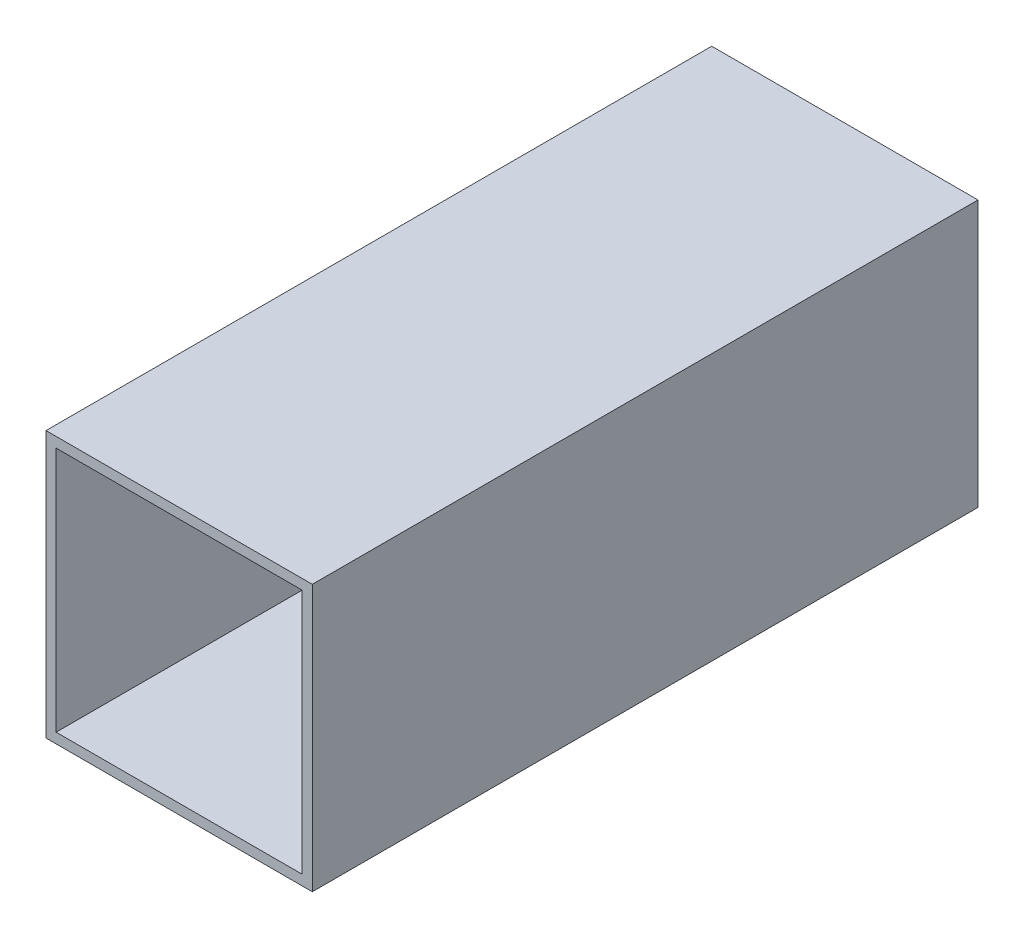
ISO-10303-21;
HEADER;
FILE_DESCRIPTION(('STEP AP214'),'2;1');
FILE_NAME('part.step','',(''),(''),'','','');
FILE_SCHEMA(('AUTOMOTIVE_DESIGN { 1 0 10303 214 1 1 1 1 }'));
ENDSEC;
DATA;
#1=APPLICATION_CONTEXT('core data for automotive mechanical design processes');
#2=APPLICATION_PROTOCOL_DEFINITION('international standard','automotive_design',2000,#1);
#3=PRODUCT_CONTEXT('',#1,'mechanical');
#4=PRODUCT('Part','Part','',(#3));
#5=PRODUCT_RELATED_PRODUCT_CATEGORY('part','',(#4));
#6=PRODUCT_DEFINITION_FORMATION('','',#4);
#7=PRODUCT_DEFINITION_CONTEXT('part definition',#1,'design');
#8=PRODUCT_DEFINITION('design','',#6,#7);
#9=PRODUCT_DEFINITION_SHAPE('','',#8);
#10=(LENGTH_UNIT() NAMED_UNIT(*) SI_UNIT(.MILLI.,.METRE.));
#11=(NAMED_UNIT(*) PLANE_ANGLE_UNIT() SI_UNIT($,.RADIAN.));
#12=(NAMED_UNIT(*) SI_UNIT($,.STERADIAN.) SOLID_ANGLE_UNIT());
#13=UNCERTAINTY_MEASURE_WITH_UNIT(LENGTH_MEASURE(1.E-05),#10,'distance_accuracy_value','');
#14=(GEOMETRIC_REPRESENTATION_CONTEXT(3) GLOBAL_UNCERTAINTY_ASSIGNED_CONTEXT((#13)) GLOBAL_UNIT_ASSIGNED_CONTEXT((#10,
#11,#12)) REPRESENTATION_CONTEXT('',''));
#15=CARTESIAN_POINT('',(0.,0.,0.));
#16=DIRECTION('',(0.,0.,1.));
#17=DIRECTION('',(1.,0.,0.));
#18=AXIS2_PLACEMENT_3D('',#15,#16,#17);
#19=CARTESIAN_POINT('',(0.,0.,190.5));
#20=DIRECTION('',(0.,0.,1.));
#21=DIRECTION('',(1.,0.,0.));
#22=AXIS2_PLACEMENT_3D('',#19,#20,#21);
#23=PLANE('',#22);
#24=DIRECTION('',(0.,-1.,0.));
#25=VECTOR('',#24,1.);
#26=CARTESIAN_POINT('',(0.,0.,190.5));
#27=LINE('',#26,#25);
#28=CARTESIAN_POINT('',(0.,0.,190.5));
#29=VERTEX_POINT('',#28);
#30=CARTESIAN_POINT('',(0.,-76.2,190.5));
#31=VERTEX_POINT('',#30);
#32=EDGE_CURVE('E134',#29,#31,#27,.T.);
#33=ORIENTED_EDGE('',*,*,#32,.T.);
#34=DIRECTION('',(1.,0.,0.));
#35=VECTOR('',#34,1.);
#36=CARTESIAN_POINT('',(0.,-76.2,190.5));
#37=LINE('',#36,#35);
#38=CARTESIAN_POINT('',(76.2,-76.2,190.5));
#39=VERTEX_POINT('',#38);
#40=EDGE_CURVE('E137',#31,#39,#37,.T.);
#41=ORIENTED_EDGE('',*,*,#40,.T.);
#42=DIRECTION('',(0.,1.,0.));
#43=VECTOR('',#42,1.);
#44=CARTESIAN_POINT('',(76.2,0.,190.5));
#45=LINE('',#44,#43);
#46=CARTESIAN_POINT('',(76.2,0.,190.5));
#47=VERTEX_POINT('',#46);
#48=EDGE_CURVE('E140',#39,#47,#45,.T.);
#49=ORIENTED_EDGE('',*,*,#48,.T.);
#50=DIRECTION('',(-1.,0.,0.));
#51=VECTOR('',#50,1.);
#52=CARTESIAN_POINT('',(0.,0.,190.5));
#53=LINE('',#52,#51);
#54=EDGE_CURVE('E142',#47,#29,#53,.T.);
#55=ORIENTED_EDGE('',*,*,#54,.T.);
#56=EDGE_LOOP('',(#33,#41,#49,#55));
#57=FACE_BOUND('',#56,.T.);
#58=DIRECTION('',(1.,0.,0.));
#59=VECTOR('',#58,1.);
#60=CARTESIAN_POINT('',(2.9,-73.3,190.5));
#61=LINE('',#60,#59);
#62=CARTESIAN_POINT('',(2.9,-73.3,190.5));
#63=VERTEX_POINT('',#62);
#64=CARTESIAN_POINT('',(73.3,-73.3,190.5));
#65=VERTEX_POINT('',#64);
#66=EDGE_CURVE('E106',#63,#65,#61,.T.);
#67=ORIENTED_EDGE('',*,*,#66,.F.);
#68=DIRECTION('',(0.,-1.,0.));
#69=VECTOR('',#68,1.);
#70=CARTESIAN_POINT('',(2.9,-2.9,190.5));
#71=LINE('',#70,#69);
#72=CARTESIAN_POINT('',(2.9,-2.9,190.5));
#73=VERTEX_POINT('',#72);
#74=EDGE_CURVE('E98',#73,#63,#71,.T.);
#75=ORIENTED_EDGE('',*,*,#74,.F.);
#76=DIRECTION('',(-1.,0.,0.));
#77=VECTOR('',#76,1.);
#78=CARTESIAN_POINT('',(2.9,-2.9,190.5));
#79=LINE('',#78,#77);
#80=CARTESIAN_POINT('',(73.3,-2.9,190.5));
#81=VERTEX_POINT('',#80);
#82=EDGE_CURVE('E120',#81,#73,#79,.T.);
#83=ORIENTED_EDGE('',*,*,#82,.F.);
#84=DIRECTION('',(0.,1.,0.));
#85=VECTOR('',#84,1.);
#86=CARTESIAN_POINT('',(73.3,-2.9,190.5));
#87=LINE('',#86,#85);
#88=EDGE_CURVE('E118',#65,#81,#87,.T.);
#89=ORIENTED_EDGE('',*,*,#88,.F.);
#90=EDGE_LOOP('',(#67,#75,#83,#89));
#91=FACE_BOUND('',#90,.T.);
#92=ADVANCED_FACE('F33',(#57,#91),#23,.T.);
#93=CARTESIAN_POINT('',(0.,0.,0.));
#94=DIRECTION('',(0.,0.,1.));
#95=DIRECTION('',(1.,0.,0.));
#96=AXIS2_PLACEMENT_3D('',#93,#94,#95);
#97=PLANE('',#96);
#98=DIRECTION('',(0.,-1.,0.));
#99=VECTOR('',#98,1.);
#100=CARTESIAN_POINT('',(0.,0.,0.));
#101=LINE('',#100,#99);
#102=CARTESIAN_POINT('',(0.,0.,0.));
#103=VERTEX_POINT('',#102);
#104=CARTESIAN_POINT('',(0.,-76.2,0.));
#105=VERTEX_POINT('',#104);
#106=EDGE_CURVE('E114',#103,#105,#101,.T.);
#107=ORIENTED_EDGE('',*,*,#106,.F.);
#108=DIRECTION('',(-1.,0.,0.));
#109=VECTOR('',#108,1.);
#110=CARTESIAN_POINT('',(0.,0.,0.));
#111=LINE('',#110,#109);
#112=CARTESIAN_POINT('',(76.2,0.,0.));
#113=VERTEX_POINT('',#112);
#114=EDGE_CURVE('E138',#113,#103,#111,.T.);
#115=ORIENTED_EDGE('',*,*,#114,.F.);
#116=DIRECTION('',(0.,1.,0.));
#117=VECTOR('',#116,1.);
#118=CARTESIAN_POINT('',(76.2,0.,0.));
#119=LINE('',#118,#117);
#120=CARTESIAN_POINT('',(76.2,-76.2,0.));
#121=VERTEX_POINT('',#120);
#122=EDGE_CURVE('E149',#121,#113,#119,.T.);
#123=ORIENTED_EDGE('',*,*,#122,.F.);
#124=DIRECTION('',(1.,0.,0.));
#125=VECTOR('',#124,1.);
#126=CARTESIAN_POINT('',(0.,-76.2,0.));
#127=LINE('',#126,#125);
#128=EDGE_CURVE('E147',#105,#121,#127,.T.);
#129=ORIENTED_EDGE('',*,*,#128,.F.);
#130=EDGE_LOOP('',(#107,#115,#123,#129));
#131=FACE_BOUND('',#130,.T.);
#132=DIRECTION('',(0.,-1.,0.));
#133=VECTOR('',#132,1.);
#134=CARTESIAN_POINT('',(2.9,-2.9,0.));
#135=LINE('',#134,#133);
#136=CARTESIAN_POINT('',(2.9,-2.9,0.));
#137=VERTEX_POINT('',#136);
#138=CARTESIAN_POINT('',(2.9,-73.3,0.));
#139=VERTEX_POINT('',#138);
#140=EDGE_CURVE('E56',#137,#139,#135,.T.);
#141=ORIENTED_EDGE('',*,*,#140,.T.);
#142=DIRECTION('',(1.,0.,0.));
#143=VECTOR('',#142,1.);
#144=CARTESIAN_POINT('',(2.9,-73.3,0.));
#145=LINE('',#144,#143);
#146=CARTESIAN_POINT('',(73.3,-73.3,0.));
#147=VERTEX_POINT('',#146);
#148=EDGE_CURVE('E113',#139,#147,#145,.T.);
#149=ORIENTED_EDGE('',*,*,#148,.T.);
#150=DIRECTION('',(0.,1.,0.));
#151=VECTOR('',#150,1.);
#152=CARTESIAN_POINT('',(73.3,-2.9,0.));
#153=LINE('',#152,#151);
#154=CARTESIAN_POINT('',(73.3,-2.9,0.));
#155=VERTEX_POINT('',#154);
#156=EDGE_CURVE('E126',#147,#155,#153,.T.);
#157=ORIENTED_EDGE('',*,*,#156,.T.);
#158=DIRECTION('',(-1.,0.,0.));
#159=VECTOR('',#158,1.);
#160=CARTESIAN_POINT('',(2.9,-2.9,0.));
#161=LINE('',#160,#159);
#162=EDGE_CURVE('E107',#155,#137,#161,.T.);
#163=ORIENTED_EDGE('',*,*,#162,.T.);
#164=EDGE_LOOP('',(#141,#149,#157,#163));
#165=FACE_BOUND('',#164,.T.);
#166=ADVANCED_FACE('F167',(#131,#165),#97,.F.);
#167=CARTESIAN_POINT('',(0.,0.,190.5));
#168=DIRECTION('',(1.,0.,0.));
#169=DIRECTION('',(0.,1.,0.));
#170=AXIS2_PLACEMENT_3D('',#167,#168,#169);
#171=PLANE('',#170);
#172=ORIENTED_EDGE('',*,*,#106,.T.);
#173=DIRECTION('',(0.,0.,-1.));
#174=VECTOR('',#173,1.);
#175=CARTESIAN_POINT('',(0.,-76.2,190.5));
#176=LINE('',#175,#174);
#177=EDGE_CURVE('E11',#31,#105,#176,.T.);
#178=ORIENTED_EDGE('',*,*,#177,.F.);
#179=ORIENTED_EDGE('',*,*,#32,.F.);
#180=DIRECTION('',(0.,0.,-1.));
#181=VECTOR('',#180,1.);
#182=CARTESIAN_POINT('',(0.,0.,190.5));
#183=LINE('',#182,#181);
#184=EDGE_CURVE('E144',#29,#103,#183,.T.);
#185=ORIENTED_EDGE('',*,*,#184,.T.);
#186=EDGE_LOOP('',(#172,#178,#179,#185));
#187=FACE_BOUND('',#186,.T.);
#188=ADVANCED_FACE('F35',(#187),#171,.F.);
#189=CARTESIAN_POINT('',(0.,-76.2,190.5));
#190=DIRECTION('',(0.,1.,0.));
#191=DIRECTION('',(0.,0.,1.));
#192=AXIS2_PLACEMENT_3D('',#189,#190,#191);
#193=PLANE('',#192);
#194=ORIENTED_EDGE('',*,*,#128,.T.);
#195=DIRECTION('',(0.,0.,-1.));
#196=VECTOR('',#195,1.);
#197=CARTESIAN_POINT('',(76.2,-76.2,190.5));
#198=LINE('',#197,#196);
#199=EDGE_CURVE('E41',#39,#121,#198,.T.);
#200=ORIENTED_EDGE('',*,*,#199,.F.);
#201=ORIENTED_EDGE('',*,*,#40,.F.);
#202=ORIENTED_EDGE('',*,*,#177,.T.);
#203=EDGE_LOOP('',(#194,#200,#201,#202));
#204=FACE_BOUND('',#203,.T.);
#205=ADVANCED_FACE('F177',(#204),#193,.F.);
#206=CARTESIAN_POINT('',(76.2,0.,190.5));
#207=DIRECTION('',(-1.,0.,0.));
#208=DIRECTION('',(0.,-1.,0.));
#209=AXIS2_PLACEMENT_3D('',#206,#207,#208);
#210=PLANE('',#209);
#211=ORIENTED_EDGE('',*,*,#122,.T.);
#212=DIRECTION('',(0.,0.,-1.));
#213=VECTOR('',#212,1.);
#214=CARTESIAN_POINT('',(76.2,0.,190.5));
#215=LINE('',#214,#213);
#216=EDGE_CURVE('E154',#47,#113,#215,.T.);
#217=ORIENTED_EDGE('',*,*,#216,.F.);
#218=ORIENTED_EDGE('',*,*,#48,.F.);
#219=ORIENTED_EDGE('',*,*,#199,.T.);
#220=EDGE_LOOP('',(#211,#217,#218,#219));
#221=FACE_BOUND('',#220,.T.);
#222=ADVANCED_FACE('F161',(#221),#210,.F.);
#223=CARTESIAN_POINT('',(0.,0.,190.5));
#224=DIRECTION('',(0.,-1.,0.));
#225=DIRECTION('',(0.,0.,-1.));
#226=AXIS2_PLACEMENT_3D('',#223,#224,#225);
#227=PLANE('',#226);
#228=ORIENTED_EDGE('',*,*,#114,.T.);
#229=ORIENTED_EDGE('',*,*,#184,.F.);
#230=ORIENTED_EDGE('',*,*,#54,.F.);
#231=ORIENTED_EDGE('',*,*,#216,.T.);
#232=EDGE_LOOP('',(#228,#229,#230,#231));
#233=FACE_BOUND('',#232,.T.);
#234=ADVANCED_FACE('F171',(#233),#227,.F.);
#235=CARTESIAN_POINT('',(2.9,-2.9,190.5));
#236=DIRECTION('',(1.,0.,0.));
#237=DIRECTION('',(0.,0.,-1.));
#238=AXIS2_PLACEMENT_3D('',#235,#236,#237);
#239=PLANE('',#238);
#240=ORIENTED_EDGE('',*,*,#140,.F.);
#241=DIRECTION('',(0.,0.,-1.));
#242=VECTOR('',#241,1.);
#243=CARTESIAN_POINT('',(2.9,-2.9,190.5));
#244=LINE('',#243,#242);
#245=EDGE_CURVE('E102',#73,#137,#244,.T.);
#246=ORIENTED_EDGE('',*,*,#245,.F.);
#247=ORIENTED_EDGE('',*,*,#74,.T.);
#248=DIRECTION('',(0.,0.,-1.));
#249=VECTOR('',#248,1.);
#250=CARTESIAN_POINT('',(2.9,-73.3,190.5));
#251=LINE('',#250,#249);
#252=EDGE_CURVE('E101',#63,#139,#251,.T.);
#253=ORIENTED_EDGE('',*,*,#252,.T.);
#254=EDGE_LOOP('',(#240,#246,#247,#253));
#255=FACE_BOUND('',#254,.T.);
#256=ADVANCED_FACE('F100',(#255),#239,.T.);
#257=CARTESIAN_POINT('',(2.9,-73.3,190.5));
#258=DIRECTION('',(0.,1.,0.));
#259=DIRECTION('',(0.,0.,1.));
#260=AXIS2_PLACEMENT_3D('',#257,#258,#259);
#261=PLANE('',#260);
#262=ORIENTED_EDGE('',*,*,#148,.F.);
#263=ORIENTED_EDGE('',*,*,#252,.F.);
#264=ORIENTED_EDGE('',*,*,#66,.T.);
#265=DIRECTION('',(0.,0.,-1.));
#266=VECTOR('',#265,1.);
#267=CARTESIAN_POINT('',(73.3,-73.3,190.5));
#268=LINE('',#267,#266);
#269=EDGE_CURVE('E115',#65,#147,#268,.T.);
#270=ORIENTED_EDGE('',*,*,#269,.T.);
#271=EDGE_LOOP('',(#262,#263,#264,#270));
#272=FACE_BOUND('',#271,.T.);
#273=ADVANCED_FACE('F110',(#272),#261,.T.);
#274=CARTESIAN_POINT('',(73.3,-2.9,190.5));
#275=DIRECTION('',(-1.,0.,0.));
#276=DIRECTION('',(0.,0.,1.));
#277=AXIS2_PLACEMENT_3D('',#274,#275,#276);
#278=PLANE('',#277);
#279=ORIENTED_EDGE('',*,*,#156,.F.);
#280=ORIENTED_EDGE('',*,*,#269,.F.);
#281=ORIENTED_EDGE('',*,*,#88,.T.);
#282=DIRECTION('',(0.,0.,-1.));
#283=VECTOR('',#282,1.);
#284=CARTESIAN_POINT('',(73.3,-2.9,190.5));
#285=LINE('',#284,#283);
#286=EDGE_CURVE('E48',#81,#155,#285,.T.);
#287=ORIENTED_EDGE('',*,*,#286,.T.);
#288=EDGE_LOOP('',(#279,#280,#281,#287));
#289=FACE_BOUND('',#288,.T.);
#290=ADVANCED_FACE('F200',(#289),#278,.T.);
#291=CARTESIAN_POINT('',(2.9,-2.9,190.5));
#292=DIRECTION('',(0.,-1.,0.));
#293=DIRECTION('',(0.,0.,-1.));
#294=AXIS2_PLACEMENT_3D('',#291,#292,#293);
#295=PLANE('',#294);
#296=ORIENTED_EDGE('',*,*,#162,.F.);
#297=ORIENTED_EDGE('',*,*,#286,.F.);
#298=ORIENTED_EDGE('',*,*,#82,.T.);
#299=ORIENTED_EDGE('',*,*,#245,.T.);
#300=EDGE_LOOP('',(#296,#297,#298,#299));
#301=FACE_BOUND('',#300,.T.);
#302=ADVANCED_FACE('F204',(#301),#295,.T.);
#303=CLOSED_SHELL('',(#92,#166,#188,#205,#222,#234,#256,#273,#290,#302));
#304=MANIFOLD_SOLID_BREP('B2',#303);
#305=ADVANCED_BREP_SHAPE_REPRESENTATION('',(#18,#304),#14);
#306=SHAPE_DEFINITION_REPRESENTATION(#9,#305);
ENDSEC;
END-ISO-10303-21;
